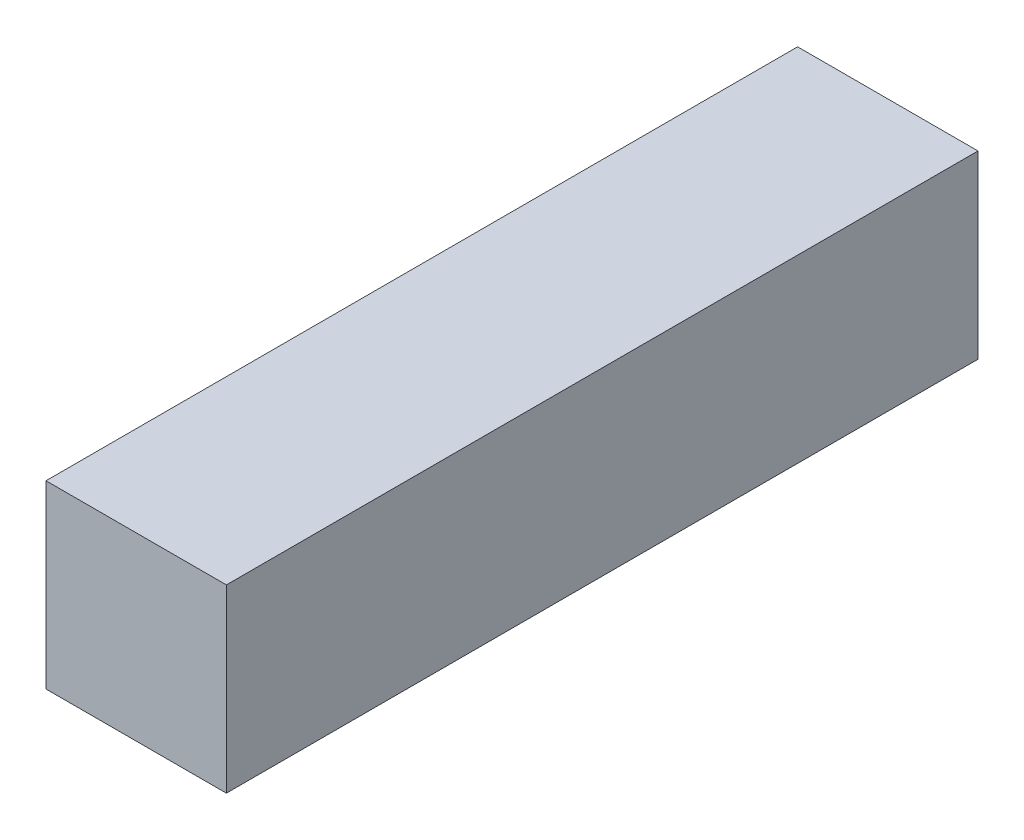
ISO-10303-21;
HEADER;
FILE_DESCRIPTION(('STEP AP214'),'2;1');
FILE_NAME('part.step','',(''),(''),'','','');
FILE_SCHEMA(('AUTOMOTIVE_DESIGN { 1 0 10303 214 1 1 1 1 }'));
ENDSEC;
DATA;
#1=APPLICATION_CONTEXT('core data for automotive mechanical design processes');
#2=APPLICATION_PROTOCOL_DEFINITION('international standard','automotive_design',2000,#1);
#3=PRODUCT_CONTEXT('',#1,'mechanical');
#4=PRODUCT('Part','Part','',(#3));
#5=PRODUCT_RELATED_PRODUCT_CATEGORY('part','',(#4));
#6=PRODUCT_DEFINITION_FORMATION('','',#4);
#7=PRODUCT_DEFINITION_CONTEXT('part definition',#1,'design');
#8=PRODUCT_DEFINITION('design','',#6,#7);
#9=PRODUCT_DEFINITION_SHAPE('','',#8);
#10=(LENGTH_UNIT() NAMED_UNIT(*) SI_UNIT(.MILLI.,.METRE.));
#11=(NAMED_UNIT(*) PLANE_ANGLE_UNIT() SI_UNIT($,.RADIAN.));
#12=(NAMED_UNIT(*) SI_UNIT($,.STERADIAN.) SOLID_ANGLE_UNIT());
#13=UNCERTAINTY_MEASURE_WITH_UNIT(LENGTH_MEASURE(1.E-05),#10,'distance_accuracy_value','');
#14=(GEOMETRIC_REPRESENTATION_CONTEXT(3) GLOBAL_UNCERTAINTY_ASSIGNED_CONTEXT((#13)) GLOBAL_UNIT_ASSIGNED_CONTEXT((#10,
#11,#12)) REPRESENTATION_CONTEXT('',''));
#15=CARTESIAN_POINT('',(0.,0.,0.));
#16=DIRECTION('',(0.,0.,1.));
#17=DIRECTION('',(1.,0.,0.));
#18=AXIS2_PLACEMENT_3D('',#15,#16,#17);
#19=CARTESIAN_POINT('',(-76.2000000000001,76.2,635.));
#20=DIRECTION('',(1.,0.,0.));
#21=DIRECTION('',(0.,0.,-1.));
#22=AXIS2_PLACEMENT_3D('',#19,#20,#21);
#23=PLANE('',#22);
#24=DIRECTION('',(0.,-1.,0.));
#25=VECTOR('',#24,1.);
#26=CARTESIAN_POINT('',(-76.2000000000001,76.2,0.));
#27=LINE('',#26,#25);
#28=CARTESIAN_POINT('',(-76.2000000000001,76.2,0.));
#29=VERTEX_POINT('',#28);
#30=CARTESIAN_POINT('',(-76.2000000000001,-76.2,0.));
#31=VERTEX_POINT('',#30);
#32=EDGE_CURVE('E117',#29,#31,#27,.T.);
#33=ORIENTED_EDGE('',*,*,#32,.T.);
#34=DIRECTION('',(0.,0.,-1.));
#35=VECTOR('',#34,1.);
#36=CARTESIAN_POINT('',(-76.2000000000001,-76.2,635.));
#37=LINE('',#36,#35);
#38=CARTESIAN_POINT('',(-76.2000000000001,-76.2,635.));
#39=VERTEX_POINT('',#38);
#40=EDGE_CURVE('E11',#39,#31,#37,.T.);
#41=ORIENTED_EDGE('',*,*,#40,.F.);
#42=DIRECTION('',(0.,-1.,0.));
#43=VECTOR('',#42,1.);
#44=CARTESIAN_POINT('',(-76.2000000000001,76.2,635.));
#45=LINE('',#44,#43);
#46=CARTESIAN_POINT('',(-76.2000000000001,76.2,635.));
#47=VERTEX_POINT('',#46);
#48=EDGE_CURVE('E101',#47,#39,#45,.T.);
#49=ORIENTED_EDGE('',*,*,#48,.F.);
#50=DIRECTION('',(0.,0.,-1.));
#51=VECTOR('',#50,1.);
#52=CARTESIAN_POINT('',(-76.2000000000001,76.2,635.));
#53=LINE('',#52,#51);
#54=EDGE_CURVE('E113',#47,#29,#53,.T.);
#55=ORIENTED_EDGE('',*,*,#54,.T.);
#56=EDGE_LOOP('',(#33,#41,#49,#55));
#57=FACE_BOUND('',#56,.T.);
#58=ADVANCED_FACE('F49',(#57),#23,.F.);
#59=CARTESIAN_POINT('',(76.1999999999999,-76.2,635.));
#60=DIRECTION('',(0.,1.,0.));
#61=DIRECTION('',(0.,0.,1.));
#62=AXIS2_PLACEMENT_3D('',#59,#60,#61);
#63=PLANE('',#62);
#64=DIRECTION('',(1.,0.,0.));
#65=VECTOR('',#64,1.);
#66=CARTESIAN_POINT('',(76.1999999999999,-76.2,0.));
#67=LINE('',#66,#65);
#68=CARTESIAN_POINT('',(76.1999999999999,-76.2,0.));
#69=VERTEX_POINT('',#68);
#70=EDGE_CURVE('E106',#31,#69,#67,.T.);
#71=ORIENTED_EDGE('',*,*,#70,.T.);
#72=DIRECTION('',(0.,0.,-1.));
#73=VECTOR('',#72,1.);
#74=CARTESIAN_POINT('',(76.1999999999999,-76.2,635.));
#75=LINE('',#74,#73);
#76=CARTESIAN_POINT('',(76.1999999999999,-76.2,635.));
#77=VERTEX_POINT('',#76);
#78=EDGE_CURVE('E58',#77,#69,#75,.T.);
#79=ORIENTED_EDGE('',*,*,#78,.F.);
#80=DIRECTION('',(1.,0.,0.));
#81=VECTOR('',#80,1.);
#82=CARTESIAN_POINT('',(76.1999999999999,-76.2,635.));
#83=LINE('',#82,#81);
#84=EDGE_CURVE('E96',#39,#77,#83,.T.);
#85=ORIENTED_EDGE('',*,*,#84,.F.);
#86=ORIENTED_EDGE('',*,*,#40,.T.);
#87=EDGE_LOOP('',(#71,#79,#85,#86));
#88=FACE_BOUND('',#87,.T.);
#89=ADVANCED_FACE('F105',(#88),#63,.F.);
#90=CARTESIAN_POINT('',(76.1999999999999,76.2,635.));
#91=DIRECTION('',(-1.,0.,0.));
#92=DIRECTION('',(0.,0.,1.));
#93=AXIS2_PLACEMENT_3D('',#90,#91,#92);
#94=PLANE('',#93);
#95=DIRECTION('',(0.,1.,0.));
#96=VECTOR('',#95,1.);
#97=CARTESIAN_POINT('',(76.1999999999999,76.2,0.));
#98=LINE('',#97,#96);
#99=CARTESIAN_POINT('',(76.1999999999999,76.2,0.));
#100=VERTEX_POINT('',#99);
#101=EDGE_CURVE('E83',#69,#100,#98,.T.);
#102=ORIENTED_EDGE('',*,*,#101,.T.);
#103=DIRECTION('',(0.,0.,-1.));
#104=VECTOR('',#103,1.);
#105=CARTESIAN_POINT('',(76.1999999999999,76.2,635.));
#106=LINE('',#105,#104);
#107=CARTESIAN_POINT('',(76.1999999999999,76.2,635.));
#108=VERTEX_POINT('',#107);
#109=EDGE_CURVE('E108',#108,#100,#106,.T.);
#110=ORIENTED_EDGE('',*,*,#109,.F.);
#111=DIRECTION('',(0.,1.,0.));
#112=VECTOR('',#111,1.);
#113=CARTESIAN_POINT('',(76.1999999999999,76.2,635.));
#114=LINE('',#113,#112);
#115=EDGE_CURVE('E99',#77,#108,#114,.T.);
#116=ORIENTED_EDGE('',*,*,#115,.F.);
#117=ORIENTED_EDGE('',*,*,#78,.T.);
#118=EDGE_LOOP('',(#102,#110,#116,#117));
#119=FACE_BOUND('',#118,.T.);
#120=ADVANCED_FACE('F109',(#119),#94,.F.);
#121=CARTESIAN_POINT('',(76.1999999999999,76.2,635.));
#122=DIRECTION('',(0.,-1.,0.));
#123=DIRECTION('',(1.,0.,0.));
#124=AXIS2_PLACEMENT_3D('',#121,#122,#123);
#125=PLANE('',#124);
#126=DIRECTION('',(-1.,0.,0.));
#127=VECTOR('',#126,1.);
#128=CARTESIAN_POINT('',(76.1999999999999,76.2,0.));
#129=LINE('',#128,#127);
#130=EDGE_CURVE('E89',#100,#29,#129,.T.);
#131=ORIENTED_EDGE('',*,*,#130,.T.);
#132=ORIENTED_EDGE('',*,*,#54,.F.);
#133=DIRECTION('',(-1.,0.,0.));
#134=VECTOR('',#133,1.);
#135=CARTESIAN_POINT('',(76.1999999999999,76.2,635.));
#136=LINE('',#135,#134);
#137=EDGE_CURVE('E66',#108,#47,#136,.T.);
#138=ORIENTED_EDGE('',*,*,#137,.F.);
#139=ORIENTED_EDGE('',*,*,#109,.T.);
#140=EDGE_LOOP('',(#131,#132,#138,#139));
#141=FACE_BOUND('',#140,.T.);
#142=ADVANCED_FACE('F130',(#141),#125,.F.);
#143=CARTESIAN_POINT('',(0.,0.,635.));
#144=DIRECTION('',(0.,0.,-1.));
#145=DIRECTION('',(-1.,0.,0.));
#146=AXIS2_PLACEMENT_3D('',#143,#144,#145);
#147=PLANE('',#146);
#148=ORIENTED_EDGE('',*,*,#48,.T.);
#149=ORIENTED_EDGE('',*,*,#84,.T.);
#150=ORIENTED_EDGE('',*,*,#115,.T.);
#151=ORIENTED_EDGE('',*,*,#137,.T.);
#152=EDGE_LOOP('',(#148,#149,#150,#151));
#153=FACE_BOUND('',#152,.T.);
#154=ADVANCED_FACE('F97',(#153),#147,.F.);
#155=CARTESIAN_POINT('',(0.,0.,0.));
#156=DIRECTION('',(0.,0.,-1.));
#157=DIRECTION('',(-1.,0.,0.));
#158=AXIS2_PLACEMENT_3D('',#155,#156,#157);
#159=PLANE('',#158);
#160=ORIENTED_EDGE('',*,*,#32,.F.);
#161=ORIENTED_EDGE('',*,*,#130,.F.);
#162=ORIENTED_EDGE('',*,*,#101,.F.);
#163=ORIENTED_EDGE('',*,*,#70,.F.);
#164=EDGE_LOOP('',(#160,#161,#162,#163));
#165=FACE_BOUND('',#164,.T.);
#166=ADVANCED_FACE('F133',(#165),#159,.T.);
#167=CLOSED_SHELL('',(#58,#89,#120,#142,#154,#166));
#168=MANIFOLD_SOLID_BREP('B2',#167);
#169=ADVANCED_BREP_SHAPE_REPRESENTATION('',(#18,#168),#14);
#170=SHAPE_DEFINITION_REPRESENTATION(#9,#169);
ENDSEC;
END-ISO-10303-21;
